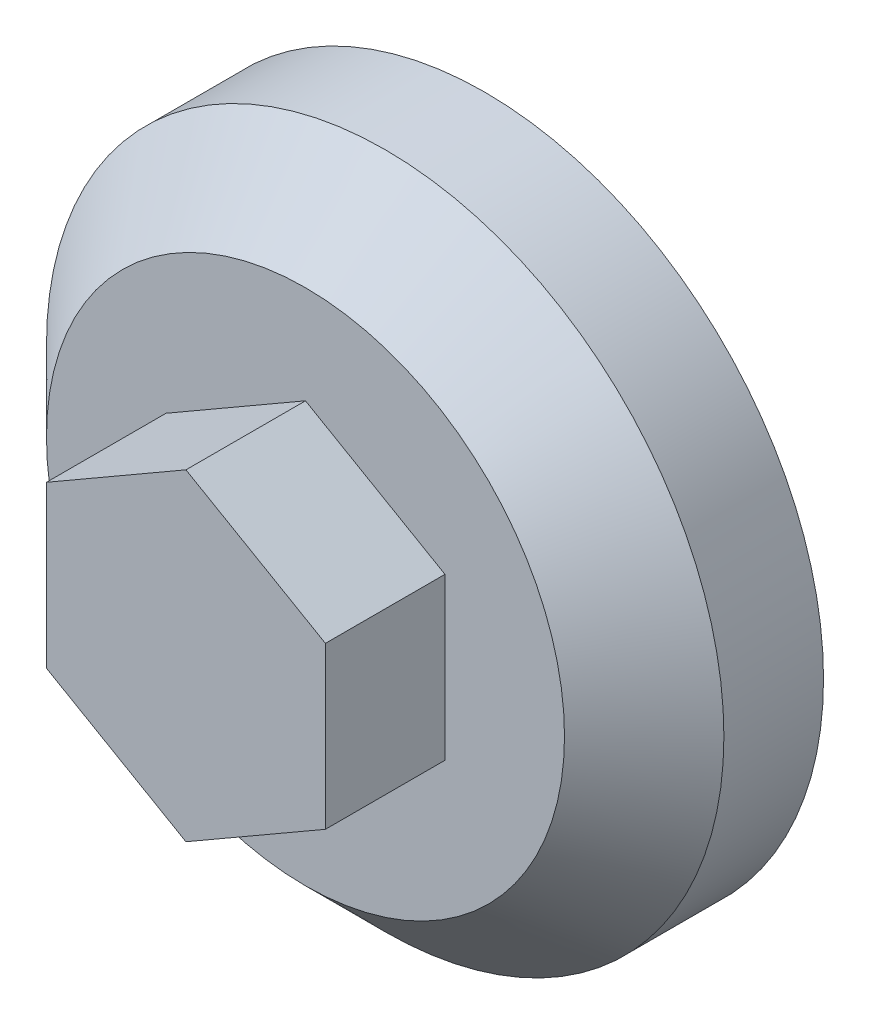
ISO-10303-21;
HEADER;
FILE_DESCRIPTION(('STEP AP214'),'2;1');
FILE_NAME('part.step','',(''),(''),'','','');
FILE_SCHEMA(('AUTOMOTIVE_DESIGN { 1 0 10303 214 1 1 1 1 }'));
ENDSEC;
DATA;
#1=APPLICATION_CONTEXT('core data for automotive mechanical design processes');
#2=APPLICATION_PROTOCOL_DEFINITION('international standard','automotive_design',2000,#1);
#3=PRODUCT_CONTEXT('',#1,'mechanical');
#4=PRODUCT('Part','Part','',(#3));
#5=PRODUCT_RELATED_PRODUCT_CATEGORY('part','',(#4));
#6=PRODUCT_DEFINITION_FORMATION('','',#4);
#7=PRODUCT_DEFINITION_CONTEXT('part definition',#1,'design');
#8=PRODUCT_DEFINITION('design','',#6,#7);
#9=PRODUCT_DEFINITION_SHAPE('','',#8);
#10=(LENGTH_UNIT() NAMED_UNIT(*) SI_UNIT(.MILLI.,.METRE.));
#11=(NAMED_UNIT(*) PLANE_ANGLE_UNIT() SI_UNIT($,.RADIAN.));
#12=(NAMED_UNIT(*) SI_UNIT($,.STERADIAN.) SOLID_ANGLE_UNIT());
#13=UNCERTAINTY_MEASURE_WITH_UNIT(LENGTH_MEASURE(1.E-05),#10,'distance_accuracy_value','');
#14=(GEOMETRIC_REPRESENTATION_CONTEXT(3) GLOBAL_UNCERTAINTY_ASSIGNED_CONTEXT((#13)) GLOBAL_UNIT_ASSIGNED_CONTEXT((#10,
#11,#12)) REPRESENTATION_CONTEXT('',''));
#15=CARTESIAN_POINT('',(0.,0.,0.));
#16=DIRECTION('',(0.,0.,1.));
#17=DIRECTION('',(1.,0.,0.));
#18=AXIS2_PLACEMENT_3D('',#15,#16,#17);
#19=CARTESIAN_POINT('',(13.,0.,9.));
#20=DIRECTION('',(0.,0.,-1.));
#21=DIRECTION('',(-1.,0.,0.));
#22=AXIS2_PLACEMENT_3D('',#19,#20,#21);
#23=PLANE('',#22);
#24=CARTESIAN_POINT('',(0.,0.,9.));
#25=DIRECTION('',(0.,0.,-1.));
#26=DIRECTION('',(-1.,0.,0.));
#27=AXIS2_PLACEMENT_3D('',#24,#25,#26);
#28=CIRCLE('',#27,13.);
#29=CARTESIAN_POINT('',(-13.,0.,9.));
#30=VERTEX_POINT('',#29);
#31=EDGE_CURVE('E111',#30,#30,#28,.T.);
#32=ORIENTED_EDGE('',*,*,#31,.F.);
#33=EDGE_LOOP('',(#32));
#34=FACE_BOUND('',#33,.T.);
#35=DIRECTION('',(0.,1.,0.));
#36=VECTOR('',#35,1.);
#37=CARTESIAN_POINT('',(7.,-4.04145188432738,9.));
#38=LINE('',#37,#36);
#39=CARTESIAN_POINT('',(7.,-4.04145188432738,9.));
#40=VERTEX_POINT('',#39);
#41=CARTESIAN_POINT('',(7.,4.04145188432738,9.));
#42=VERTEX_POINT('',#41);
#43=EDGE_CURVE('E57',#40,#42,#38,.T.);
#44=ORIENTED_EDGE('',*,*,#43,.F.);
#45=DIRECTION('',(0.866025403784439,0.5,0.));
#46=VECTOR('',#45,1.);
#47=CARTESIAN_POINT('',(0.,-8.08290376865476,9.));
#48=LINE('',#47,#46);
#49=CARTESIAN_POINT('',(0.,-8.08290376865476,9.));
#50=VERTEX_POINT('',#49);
#51=EDGE_CURVE('E58',#50,#40,#48,.T.);
#52=ORIENTED_EDGE('',*,*,#51,.F.);
#53=DIRECTION('',(0.866025403784439,-0.5,0.));
#54=VECTOR('',#53,1.);
#55=CARTESIAN_POINT('',(-7.,-4.04145188432738,9.));
#56=LINE('',#55,#54);
#57=CARTESIAN_POINT('',(-7.,-4.04145188432738,9.));
#58=VERTEX_POINT('',#57);
#59=EDGE_CURVE('E230',#58,#50,#56,.T.);
#60=ORIENTED_EDGE('',*,*,#59,.F.);
#61=DIRECTION('',(0.,-1.,0.));
#62=VECTOR('',#61,1.);
#63=CARTESIAN_POINT('',(-7.,4.04145188432738,9.));
#64=LINE('',#63,#62);
#65=CARTESIAN_POINT('',(-7.,4.04145188432738,9.));
#66=VERTEX_POINT('',#65);
#67=EDGE_CURVE('E245',#66,#58,#64,.T.);
#68=ORIENTED_EDGE('',*,*,#67,.F.);
#69=DIRECTION('',(-0.866025403784439,-0.5,0.));
#70=VECTOR('',#69,1.);
#71=CARTESIAN_POINT('',(0.,8.08290376865476,9.));
#72=LINE('',#71,#70);
#73=CARTESIAN_POINT('',(0.,8.08290376865476,9.));
#74=VERTEX_POINT('',#73);
#75=EDGE_CURVE('E243',#74,#66,#72,.T.);
#76=ORIENTED_EDGE('',*,*,#75,.F.);
#77=DIRECTION('',(-0.866025403784439,0.5,0.));
#78=VECTOR('',#77,1.);
#79=CARTESIAN_POINT('',(7.,4.04145188432738,9.));
#80=LINE('',#79,#78);
#81=EDGE_CURVE('E246',#42,#74,#80,.T.);
#82=ORIENTED_EDGE('',*,*,#81,.F.);
#83=EDGE_LOOP('',(#44,#52,#60,#68,#76,#82));
#84=FACE_BOUND('',#83,.T.);
#85=ADVANCED_FACE('F41',(#34,#84),#23,.F.);
#86=CARTESIAN_POINT('',(0.,0.,0.));
#87=DIRECTION('',(0.,0.,1.));
#88=DIRECTION('',(1.,0.,0.));
#89=AXIS2_PLACEMENT_3D('',#86,#87,#88);
#90=PLANE('',#89);
#91=CARTESIAN_POINT('',(0.,0.,0.));
#92=DIRECTION('',(0.,0.,-1.));
#93=DIRECTION('',(-1.,0.,0.));
#94=AXIS2_PLACEMENT_3D('',#91,#92,#93);
#95=CIRCLE('',#94,17.);
#96=CARTESIAN_POINT('',(-17.,0.,0.));
#97=VERTEX_POINT('',#96);
#98=EDGE_CURVE('E11',#97,#97,#95,.T.);
#99=ORIENTED_EDGE('',*,*,#98,.T.);
#100=EDGE_LOOP('',(#99));
#101=FACE_BOUND('',#100,.T.);
#102=ADVANCED_FACE('F43',(#101),#90,.F.);
#103=CARTESIAN_POINT('',(0.,0.,-5.));
#104=DIRECTION('',(0.,0.,-1.));
#105=DIRECTION('',(-1.,0.,0.));
#106=AXIS2_PLACEMENT_3D('',#103,#104,#105);
#107=CYLINDRICAL_SURFACE('',#106,17.);
#108=ORIENTED_EDGE('',*,*,#98,.F.);
#109=EDGE_LOOP('',(#108));
#110=FACE_BOUND('',#109,.T.);
#111=CARTESIAN_POINT('',(0.,0.,5.));
#112=DIRECTION('',(0.,0.,-1.));
#113=DIRECTION('',(-1.,0.,0.));
#114=AXIS2_PLACEMENT_3D('',#111,#112,#113);
#115=CIRCLE('',#114,17.);
#116=CARTESIAN_POINT('',(-17.,0.,5.));
#117=VERTEX_POINT('',#116);
#118=EDGE_CURVE('E47',#117,#117,#115,.T.);
#119=ORIENTED_EDGE('',*,*,#118,.T.);
#120=EDGE_LOOP('',(#119));
#121=FACE_BOUND('',#120,.T.);
#122=ADVANCED_FACE('F123',(#110,#121),#107,.T.);
#123=CARTESIAN_POINT('',(0.,0.,9.));
#124=DIRECTION('',(0.,0.,-1.));
#125=DIRECTION('',(-1.,0.,0.));
#126=AXIS2_PLACEMENT_3D('',#123,#124,#125);
#127=CONICAL_SURFACE('',#126,13.,0.785398163397448);
#128=ORIENTED_EDGE('',*,*,#118,.F.);
#129=EDGE_LOOP('',(#128));
#130=FACE_BOUND('',#129,.T.);
#131=ORIENTED_EDGE('',*,*,#31,.T.);
#132=EDGE_LOOP('',(#131));
#133=FACE_BOUND('',#132,.T.);
#134=ADVANCED_FACE('F127',(#130,#133),#127,.T.);
#135=CARTESIAN_POINT('',(7.,-4.04145188432738,15.));
#136=DIRECTION('',(-1.,0.,0.));
#137=DIRECTION('',(0.,-1.,0.));
#138=AXIS2_PLACEMENT_3D('',#135,#136,#137);
#139=PLANE('',#138);
#140=ORIENTED_EDGE('',*,*,#43,.T.);
#141=DIRECTION('',(0.,0.,-1.));
#142=VECTOR('',#141,1.);
#143=CARTESIAN_POINT('',(7.,4.04145188432738,15.));
#144=LINE('',#143,#142);
#145=CARTESIAN_POINT('',(7.,4.04145188432738,15.));
#146=VERTEX_POINT('',#145);
#147=EDGE_CURVE('E100',#146,#42,#144,.T.);
#148=ORIENTED_EDGE('',*,*,#147,.F.);
#149=DIRECTION('',(0.,1.,0.));
#150=VECTOR('',#149,1.);
#151=CARTESIAN_POINT('',(7.,-4.04145188432738,15.));
#152=LINE('',#151,#150);
#153=CARTESIAN_POINT('',(7.,-4.04145188432738,15.));
#154=VERTEX_POINT('',#153);
#155=EDGE_CURVE('E103',#154,#146,#152,.T.);
#156=ORIENTED_EDGE('',*,*,#155,.F.);
#157=DIRECTION('',(0.,0.,-1.));
#158=VECTOR('',#157,1.);
#159=CARTESIAN_POINT('',(7.,-4.04145188432738,15.));
#160=LINE('',#159,#158);
#161=EDGE_CURVE('E221',#154,#40,#160,.T.);
#162=ORIENTED_EDGE('',*,*,#161,.T.);
#163=EDGE_LOOP('',(#140,#148,#156,#162));
#164=FACE_BOUND('',#163,.T.);
#165=ADVANCED_FACE('F114',(#164),#139,.F.);
#166=CARTESIAN_POINT('',(7.,4.04145188432738,15.));
#167=DIRECTION('',(-0.5,-0.866025403784438,0.));
#168=DIRECTION('',(0.866025403784439,-0.5,0.));
#169=AXIS2_PLACEMENT_3D('',#166,#167,#168);
#170=PLANE('',#169);
#171=ORIENTED_EDGE('',*,*,#81,.T.);
#172=DIRECTION('',(0.,0.,-1.));
#173=VECTOR('',#172,1.);
#174=CARTESIAN_POINT('',(0.,8.08290376865476,15.));
#175=LINE('',#174,#173);
#176=CARTESIAN_POINT('',(0.,8.08290376865476,15.));
#177=VERTEX_POINT('',#176);
#178=EDGE_CURVE('E97',#177,#74,#175,.T.);
#179=ORIENTED_EDGE('',*,*,#178,.F.);
#180=DIRECTION('',(-0.866025403784439,0.5,0.));
#181=VECTOR('',#180,1.);
#182=CARTESIAN_POINT('',(7.,4.04145188432738,15.));
#183=LINE('',#182,#181);
#184=EDGE_CURVE('E95',#146,#177,#183,.T.);
#185=ORIENTED_EDGE('',*,*,#184,.F.);
#186=ORIENTED_EDGE('',*,*,#147,.T.);
#187=EDGE_LOOP('',(#171,#179,#185,#186));
#188=FACE_BOUND('',#187,.T.);
#189=ADVANCED_FACE('F92',(#188),#170,.F.);
#190=CARTESIAN_POINT('',(0.,8.08290376865476,15.));
#191=DIRECTION('',(0.5,-0.866025403784439,0.));
#192=DIRECTION('',(0.866025403784439,0.5,0.));
#193=AXIS2_PLACEMENT_3D('',#190,#191,#192);
#194=PLANE('',#193);
#195=ORIENTED_EDGE('',*,*,#75,.T.);
#196=DIRECTION('',(0.,0.,-1.));
#197=VECTOR('',#196,1.);
#198=CARTESIAN_POINT('',(-7.,4.04145188432738,15.));
#199=LINE('',#198,#197);
#200=CARTESIAN_POINT('',(-7.,4.04145188432738,15.));
#201=VERTEX_POINT('',#200);
#202=EDGE_CURVE('E119',#201,#66,#199,.T.);
#203=ORIENTED_EDGE('',*,*,#202,.F.);
#204=DIRECTION('',(-0.866025403784439,-0.5,0.));
#205=VECTOR('',#204,1.);
#206=CARTESIAN_POINT('',(0.,8.08290376865476,15.));
#207=LINE('',#206,#205);
#208=EDGE_CURVE('E105',#177,#201,#207,.T.);
#209=ORIENTED_EDGE('',*,*,#208,.F.);
#210=ORIENTED_EDGE('',*,*,#178,.T.);
#211=EDGE_LOOP('',(#195,#203,#209,#210));
#212=FACE_BOUND('',#211,.T.);
#213=ADVANCED_FACE('F169',(#212),#194,.F.);
#214=CARTESIAN_POINT('',(-7.,4.04145188432738,15.));
#215=DIRECTION('',(1.,0.,0.));
#216=DIRECTION('',(0.,1.,0.));
#217=AXIS2_PLACEMENT_3D('',#214,#215,#216);
#218=PLANE('',#217);
#219=ORIENTED_EDGE('',*,*,#67,.T.);
#220=DIRECTION('',(0.,0.,-1.));
#221=VECTOR('',#220,1.);
#222=CARTESIAN_POINT('',(-7.,-4.04145188432738,15.));
#223=LINE('',#222,#221);
#224=CARTESIAN_POINT('',(-7.,-4.04145188432738,15.));
#225=VERTEX_POINT('',#224);
#226=EDGE_CURVE('E228',#225,#58,#223,.T.);
#227=ORIENTED_EDGE('',*,*,#226,.F.);
#228=DIRECTION('',(0.,-1.,0.));
#229=VECTOR('',#228,1.);
#230=CARTESIAN_POINT('',(-7.,4.04145188432738,15.));
#231=LINE('',#230,#229);
#232=EDGE_CURVE('E244',#201,#225,#231,.T.);
#233=ORIENTED_EDGE('',*,*,#232,.F.);
#234=ORIENTED_EDGE('',*,*,#202,.T.);
#235=EDGE_LOOP('',(#219,#227,#233,#234));
#236=FACE_BOUND('',#235,.T.);
#237=ADVANCED_FACE('F177',(#236),#218,.F.);
#238=CARTESIAN_POINT('',(-7.,-4.04145188432738,15.));
#239=DIRECTION('',(0.5,0.866025403784438,0.));
#240=DIRECTION('',(-0.866025403784439,0.5,0.));
#241=AXIS2_PLACEMENT_3D('',#238,#239,#240);
#242=PLANE('',#241);
#243=ORIENTED_EDGE('',*,*,#59,.T.);
#244=DIRECTION('',(0.,0.,-1.));
#245=VECTOR('',#244,1.);
#246=CARTESIAN_POINT('',(0.,-8.08290376865476,15.));
#247=LINE('',#246,#245);
#248=CARTESIAN_POINT('',(0.,-8.08290376865476,15.));
#249=VERTEX_POINT('',#248);
#250=EDGE_CURVE('E227',#249,#50,#247,.T.);
#251=ORIENTED_EDGE('',*,*,#250,.F.);
#252=DIRECTION('',(0.866025403784439,-0.5,0.));
#253=VECTOR('',#252,1.);
#254=CARTESIAN_POINT('',(-7.,-4.04145188432738,15.));
#255=LINE('',#254,#253);
#256=EDGE_CURVE('E232',#225,#249,#255,.T.);
#257=ORIENTED_EDGE('',*,*,#256,.F.);
#258=ORIENTED_EDGE('',*,*,#226,.T.);
#259=EDGE_LOOP('',(#243,#251,#257,#258));
#260=FACE_BOUND('',#259,.T.);
#261=ADVANCED_FACE('F189',(#260),#242,.F.);
#262=CARTESIAN_POINT('',(0.,-8.08290376865476,15.));
#263=DIRECTION('',(-0.5,0.866025403784438,0.));
#264=DIRECTION('',(-0.866025403784439,-0.5,0.));
#265=AXIS2_PLACEMENT_3D('',#262,#263,#264);
#266=PLANE('',#265);
#267=ORIENTED_EDGE('',*,*,#51,.T.);
#268=ORIENTED_EDGE('',*,*,#161,.F.);
#269=DIRECTION('',(0.866025403784439,0.5,0.));
#270=VECTOR('',#269,1.);
#271=CARTESIAN_POINT('',(0.,-8.08290376865476,15.));
#272=LINE('',#271,#270);
#273=EDGE_CURVE('E107',#249,#154,#272,.T.);
#274=ORIENTED_EDGE('',*,*,#273,.F.);
#275=ORIENTED_EDGE('',*,*,#250,.T.);
#276=EDGE_LOOP('',(#267,#268,#274,#275));
#277=FACE_BOUND('',#276,.T.);
#278=ADVANCED_FACE('F200',(#277),#266,.F.);
#279=CARTESIAN_POINT('',(0.,0.,15.));
#280=DIRECTION('',(0.,0.,1.));
#281=DIRECTION('',(1.,0.,0.));
#282=AXIS2_PLACEMENT_3D('',#279,#280,#281);
#283=PLANE('',#282);
#284=ORIENTED_EDGE('',*,*,#155,.T.);
#285=ORIENTED_EDGE('',*,*,#184,.T.);
#286=ORIENTED_EDGE('',*,*,#208,.T.);
#287=ORIENTED_EDGE('',*,*,#232,.T.);
#288=ORIENTED_EDGE('',*,*,#256,.T.);
#289=ORIENTED_EDGE('',*,*,#273,.T.);
#290=EDGE_LOOP('',(#284,#285,#286,#287,#288,#289));
#291=FACE_BOUND('',#290,.T.);
#292=ADVANCED_FACE('F106',(#291),#283,.T.);
#293=CLOSED_SHELL('',(#85,#102,#122,#134,#165,#189,#213,#237,#261,#278,#292));
#294=MANIFOLD_SOLID_BREP('B2',#293);
#295=ADVANCED_BREP_SHAPE_REPRESENTATION('',(#18,#294),#14);
#296=SHAPE_DEFINITION_REPRESENTATION(#9,#295);
ENDSEC;
END-ISO-10303-21;
